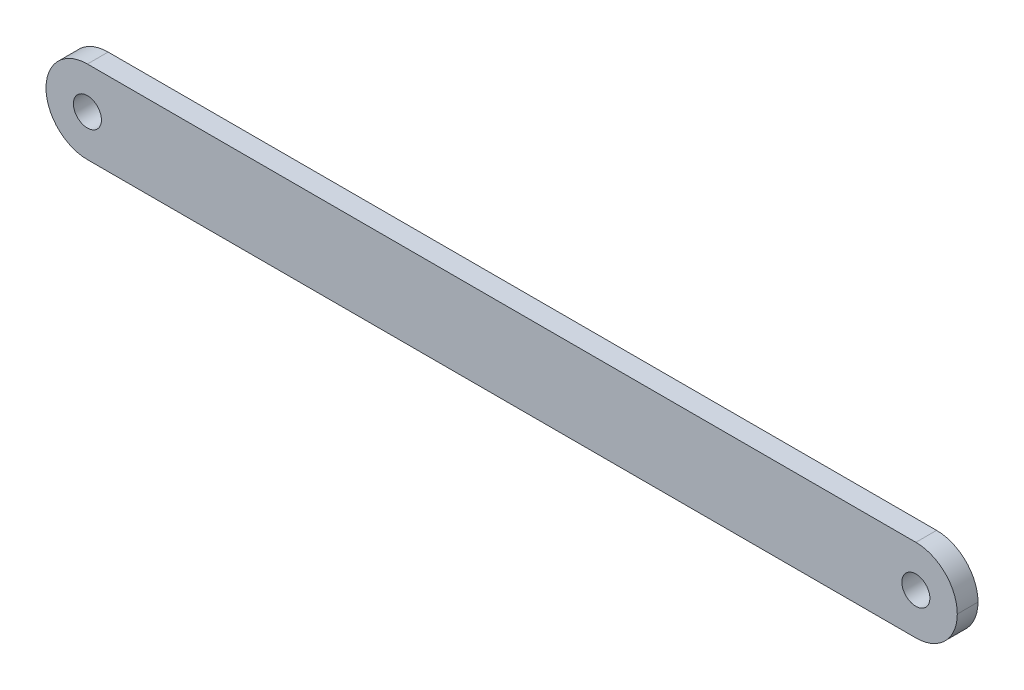
ISO-10303-21;
HEADER;
FILE_DESCRIPTION(('STEP AP214'),'2;1');
FILE_NAME('part.step','',(''),(''),'','','');
FILE_SCHEMA(('AUTOMOTIVE_DESIGN { 1 0 10303 214 1 1 1 1 }'));
ENDSEC;
DATA;
#1=APPLICATION_CONTEXT('core data for automotive mechanical design processes');
#2=APPLICATION_PROTOCOL_DEFINITION('international standard','automotive_design',2000,#1);
#3=PRODUCT_CONTEXT('',#1,'mechanical');
#4=PRODUCT('Part','Part','',(#3));
#5=PRODUCT_RELATED_PRODUCT_CATEGORY('part','',(#4));
#6=PRODUCT_DEFINITION_FORMATION('','',#4);
#7=PRODUCT_DEFINITION_CONTEXT('part definition',#1,'design');
#8=PRODUCT_DEFINITION('design','',#6,#7);
#9=PRODUCT_DEFINITION_SHAPE('','',#8);
#10=(LENGTH_UNIT() NAMED_UNIT(*) SI_UNIT(.MILLI.,.METRE.));
#11=(NAMED_UNIT(*) PLANE_ANGLE_UNIT() SI_UNIT($,.RADIAN.));
#12=(NAMED_UNIT(*) SI_UNIT($,.STERADIAN.) SOLID_ANGLE_UNIT());
#13=UNCERTAINTY_MEASURE_WITH_UNIT(LENGTH_MEASURE(1.E-05),#10,'distance_accuracy_value','');
#14=(GEOMETRIC_REPRESENTATION_CONTEXT(3) GLOBAL_UNCERTAINTY_ASSIGNED_CONTEXT((#13)) GLOBAL_UNIT_ASSIGNED_CONTEXT((#10,
#11,#12)) REPRESENTATION_CONTEXT('',''));
#15=CARTESIAN_POINT('',(0.,0.,0.));
#16=DIRECTION('',(0.,0.,1.));
#17=DIRECTION('',(1.,0.,0.));
#18=AXIS2_PLACEMENT_3D('',#15,#16,#17);
#19=CARTESIAN_POINT('',(55.8602219741314,4.,1.));
#20=DIRECTION('',(0.,0.,1.));
#21=DIRECTION('',(1.,0.,0.));
#22=AXIS2_PLACEMENT_3D('',#19,#20,#21);
#23=CYLINDRICAL_SURFACE('',#22,4.);
#24=CARTESIAN_POINT('',(55.8602219741314,4.,3.));
#25=DIRECTION('',(0.,0.,1.));
#26=DIRECTION('',(1.,0.,0.));
#27=AXIS2_PLACEMENT_3D('',#24,#25,#26);
#28=CIRCLE('',#27,4.);
#29=CARTESIAN_POINT('',(55.8602219741314,0.,3.));
#30=VERTEX_POINT('',#29);
#31=CARTESIAN_POINT('',(59.8602219741314,4.,3.));
#32=VERTEX_POINT('',#31);
#33=EDGE_CURVE('E123',#30,#32,#28,.T.);
#34=ORIENTED_EDGE('',*,*,#33,.F.);
#35=DIRECTION('',(0.,0.,1.));
#36=VECTOR('',#35,1.);
#37=CARTESIAN_POINT('',(55.8602219741314,0.,1.));
#38=LINE('',#37,#36);
#39=CARTESIAN_POINT('',(55.8602219741314,0.,1.));
#40=VERTEX_POINT('',#39);
#41=EDGE_CURVE('E11',#40,#30,#38,.T.);
#42=ORIENTED_EDGE('',*,*,#41,.F.);
#43=CARTESIAN_POINT('',(55.8602219741314,4.,1.));
#44=DIRECTION('',(0.,0.,1.));
#45=DIRECTION('',(1.,0.,0.));
#46=AXIS2_PLACEMENT_3D('',#43,#44,#45);
#47=CIRCLE('',#46,4.);
#48=CARTESIAN_POINT('',(59.8602219741314,4.,1.));
#49=VERTEX_POINT('',#48);
#50=EDGE_CURVE('E138',#40,#49,#47,.T.);
#51=ORIENTED_EDGE('',*,*,#50,.T.);
#52=DIRECTION('',(0.,0.,1.));
#53=VECTOR('',#52,1.);
#54=CARTESIAN_POINT('',(59.8602219741314,4.,1.));
#55=LINE('',#54,#53);
#56=EDGE_CURVE('E41',#49,#32,#55,.T.);
#57=ORIENTED_EDGE('',*,*,#56,.T.);
#58=EDGE_LOOP('',(#34,#42,#51,#57));
#59=FACE_BOUND('',#58,.T.);
#60=ADVANCED_FACE('F38',(#59),#23,.T.);
#61=CARTESIAN_POINT('',(-24.1383206601164,0.,1.));
#62=DIRECTION('',(0.,-1.,0.));
#63=DIRECTION('',(0.,0.,-1.));
#64=AXIS2_PLACEMENT_3D('',#61,#62,#63);
#65=PLANE('',#64);
#66=DIRECTION('',(1.,0.,0.));
#67=VECTOR('',#66,1.);
#68=CARTESIAN_POINT('',(-24.1383206601164,0.,3.));
#69=LINE('',#68,#67);
#70=CARTESIAN_POINT('',(-24.1383206601164,0.,3.));
#71=VERTEX_POINT('',#70);
#72=EDGE_CURVE('E136',#71,#30,#69,.T.);
#73=ORIENTED_EDGE('',*,*,#72,.F.);
#74=DIRECTION('',(0.,0.,1.));
#75=VECTOR('',#74,1.);
#76=CARTESIAN_POINT('',(-24.1383206601164,0.,1.));
#77=LINE('',#76,#75);
#78=CARTESIAN_POINT('',(-24.1383206601164,0.,1.));
#79=VERTEX_POINT('',#78);
#80=EDGE_CURVE('E47',#79,#71,#77,.T.);
#81=ORIENTED_EDGE('',*,*,#80,.F.);
#82=DIRECTION('',(1.,0.,0.));
#83=VECTOR('',#82,1.);
#84=CARTESIAN_POINT('',(-24.1383206601164,0.,1.));
#85=LINE('',#84,#83);
#86=EDGE_CURVE('E113',#79,#40,#85,.T.);
#87=ORIENTED_EDGE('',*,*,#86,.T.);
#88=ORIENTED_EDGE('',*,*,#41,.T.);
#89=EDGE_LOOP('',(#73,#81,#87,#88));
#90=FACE_BOUND('',#89,.T.);
#91=ADVANCED_FACE('F146',(#90),#65,.T.);
#92=CARTESIAN_POINT('',(-24.1383206601164,4.,1.));
#93=DIRECTION('',(0.,0.,1.));
#94=DIRECTION('',(1.,0.,0.));
#95=AXIS2_PLACEMENT_3D('',#92,#93,#94);
#96=CYLINDRICAL_SURFACE('',#95,4.);
#97=CARTESIAN_POINT('',(-24.1383206601164,4.,3.));
#98=DIRECTION('',(0.,0.,1.));
#99=DIRECTION('',(1.,0.,0.));
#100=AXIS2_PLACEMENT_3D('',#97,#98,#99);
#101=CIRCLE('',#100,4.);
#102=CARTESIAN_POINT('',(-28.1383205351164,3.999,3.));
#103=VERTEX_POINT('',#102);
#104=EDGE_CURVE('E100',#103,#71,#101,.T.);
#105=ORIENTED_EDGE('',*,*,#104,.F.);
#106=DIRECTION('',(0.,0.,1.));
#107=VECTOR('',#106,1.);
#108=CARTESIAN_POINT('',(-28.1383205351164,3.999,1.));
#109=LINE('',#108,#107);
#110=CARTESIAN_POINT('',(-28.1383205351164,3.999,1.));
#111=VERTEX_POINT('',#110);
#112=EDGE_CURVE('E95',#111,#103,#109,.T.);
#113=ORIENTED_EDGE('',*,*,#112,.F.);
#114=CARTESIAN_POINT('',(-24.1383206601164,4.,1.));
#115=DIRECTION('',(0.,0.,1.));
#116=DIRECTION('',(1.,0.,0.));
#117=AXIS2_PLACEMENT_3D('',#114,#115,#116);
#118=CIRCLE('',#117,4.);
#119=EDGE_CURVE('E98',#111,#79,#118,.T.);
#120=ORIENTED_EDGE('',*,*,#119,.T.);
#121=ORIENTED_EDGE('',*,*,#80,.T.);
#122=EDGE_LOOP('',(#105,#113,#120,#121));
#123=FACE_BOUND('',#122,.T.);
#124=ADVANCED_FACE('F97',(#123),#96,.T.);
#125=CARTESIAN_POINT('',(-24.1383205351164,3.999,1.));
#126=DIRECTION('',(0.,0.,1.));
#127=DIRECTION('',(1.,0.,0.));
#128=AXIS2_PLACEMENT_3D('',#125,#126,#127);
#129=CYLINDRICAL_SURFACE('',#128,4.);
#130=CARTESIAN_POINT('',(-24.1383205351164,3.999,3.));
#131=DIRECTION('',(0.,0.,1.));
#132=DIRECTION('',(1.,0.,0.));
#133=AXIS2_PLACEMENT_3D('',#130,#131,#132);
#134=CIRCLE('',#133,4.);
#135=CARTESIAN_POINT('',(-24.1383205351164,7.999,3.));
#136=VERTEX_POINT('',#135);
#137=EDGE_CURVE('E133',#136,#103,#134,.T.);
#138=ORIENTED_EDGE('',*,*,#137,.F.);
#139=DIRECTION('',(0.,0.,1.));
#140=VECTOR('',#139,1.);
#141=CARTESIAN_POINT('',(-24.1383205351164,7.999,1.));
#142=LINE('',#141,#140);
#143=CARTESIAN_POINT('',(-24.1383205351164,7.999,1.));
#144=VERTEX_POINT('',#143);
#145=EDGE_CURVE('E105',#144,#136,#142,.T.);
#146=ORIENTED_EDGE('',*,*,#145,.F.);
#147=CARTESIAN_POINT('',(-24.1383205351164,3.999,1.));
#148=DIRECTION('',(0.,0.,1.));
#149=DIRECTION('',(1.,0.,0.));
#150=AXIS2_PLACEMENT_3D('',#147,#148,#149);
#151=CIRCLE('',#150,4.);
#152=EDGE_CURVE('E111',#144,#111,#151,.T.);
#153=ORIENTED_EDGE('',*,*,#152,.T.);
#154=ORIENTED_EDGE('',*,*,#112,.T.);
#155=EDGE_LOOP('',(#138,#146,#153,#154));
#156=FACE_BOUND('',#155,.T.);
#157=ADVANCED_FACE('F115',(#156),#129,.T.);
#158=CARTESIAN_POINT('',(55.8602220991314,7.999,1.));
#159=DIRECTION('',(0.,1.,0.));
#160=DIRECTION('',(0.,0.,1.));
#161=AXIS2_PLACEMENT_3D('',#158,#159,#160);
#162=PLANE('',#161);
#163=DIRECTION('',(-1.,0.,0.));
#164=VECTOR('',#163,1.);
#165=CARTESIAN_POINT('',(55.8602220991314,7.999,3.));
#166=LINE('',#165,#164);
#167=CARTESIAN_POINT('',(55.8602220991314,7.999,3.));
#168=VERTEX_POINT('',#167);
#169=EDGE_CURVE('E130',#168,#136,#166,.T.);
#170=ORIENTED_EDGE('',*,*,#169,.F.);
#171=DIRECTION('',(0.,0.,1.));
#172=VECTOR('',#171,1.);
#173=CARTESIAN_POINT('',(55.8602220991314,7.999,1.));
#174=LINE('',#173,#172);
#175=CARTESIAN_POINT('',(55.8602220991314,7.999,1.));
#176=VERTEX_POINT('',#175);
#177=EDGE_CURVE('E141',#176,#168,#174,.T.);
#178=ORIENTED_EDGE('',*,*,#177,.F.);
#179=DIRECTION('',(-1.,0.,0.));
#180=VECTOR('',#179,1.);
#181=CARTESIAN_POINT('',(55.8602220991314,7.999,1.));
#182=LINE('',#181,#180);
#183=EDGE_CURVE('E116',#176,#144,#182,.T.);
#184=ORIENTED_EDGE('',*,*,#183,.T.);
#185=ORIENTED_EDGE('',*,*,#145,.T.);
#186=EDGE_LOOP('',(#170,#178,#184,#185));
#187=FACE_BOUND('',#186,.T.);
#188=ADVANCED_FACE('F159',(#187),#162,.T.);
#189=CARTESIAN_POINT('',(55.8602220991314,3.999,1.));
#190=DIRECTION('',(0.,0.,1.));
#191=DIRECTION('',(1.,0.,0.));
#192=AXIS2_PLACEMENT_3D('',#189,#190,#191);
#193=CYLINDRICAL_SURFACE('',#192,4.);
#194=CARTESIAN_POINT('',(55.8602220991314,3.999,3.));
#195=DIRECTION('',(0.,0.,1.));
#196=DIRECTION('',(1.,0.,0.));
#197=AXIS2_PLACEMENT_3D('',#194,#195,#196);
#198=CIRCLE('',#197,4.);
#199=EDGE_CURVE('E126',#32,#168,#198,.T.);
#200=ORIENTED_EDGE('',*,*,#199,.F.);
#201=ORIENTED_EDGE('',*,*,#56,.F.);
#202=CARTESIAN_POINT('',(55.8602220991314,3.999,1.));
#203=DIRECTION('',(0.,0.,1.));
#204=DIRECTION('',(1.,0.,0.));
#205=AXIS2_PLACEMENT_3D('',#202,#203,#204);
#206=CIRCLE('',#205,4.);
#207=EDGE_CURVE('E118',#49,#176,#206,.T.);
#208=ORIENTED_EDGE('',*,*,#207,.T.);
#209=ORIENTED_EDGE('',*,*,#177,.T.);
#210=EDGE_LOOP('',(#200,#201,#208,#209));
#211=FACE_BOUND('',#210,.T.);
#212=ADVANCED_FACE('F143',(#211),#193,.T.);
#213=CARTESIAN_POINT('',(55.8602219741314,4.,1.));
#214=DIRECTION('',(0.,0.,1.));
#215=DIRECTION('',(1.,0.,0.));
#216=AXIS2_PLACEMENT_3D('',#213,#214,#215);
#217=PLANE('',#216);
#218=CARTESIAN_POINT('',(-24.138809000818,3.99851153429841,1.));
#219=DIRECTION('',(0.,0.,1.));
#220=DIRECTION('',(-1.,0.,0.));
#221=AXIS2_PLACEMENT_3D('',#218,#219,#220);
#222=CIRCLE('',#221,1.35401050244143);
#223=CARTESIAN_POINT('',(-25.4928195032594,3.99851153429841,1.));
#224=VERTEX_POINT('',#223);
#225=EDGE_CURVE('E185',#224,#224,#222,.T.);
#226=ORIENTED_EDGE('',*,*,#225,.T.);
#227=EDGE_LOOP('',(#226));
#228=FACE_BOUND('',#227,.T.);
#229=CARTESIAN_POINT('',(55.8597335084298,3.99951153429841,1.));
#230=DIRECTION('',(0.,0.,1.));
#231=DIRECTION('',(-1.,0.,0.));
#232=AXIS2_PLACEMENT_3D('',#229,#230,#231);
#233=CIRCLE('',#232,1.35401050244143);
#234=CARTESIAN_POINT('',(54.5057230059884,3.99951153429841,1.));
#235=VERTEX_POINT('',#234);
#236=EDGE_CURVE('E127',#235,#235,#233,.T.);
#237=ORIENTED_EDGE('',*,*,#236,.T.);
#238=EDGE_LOOP('',(#237));
#239=FACE_BOUND('',#238,.T.);
#240=ORIENTED_EDGE('',*,*,#50,.F.);
#241=ORIENTED_EDGE('',*,*,#86,.F.);
#242=ORIENTED_EDGE('',*,*,#119,.F.);
#243=ORIENTED_EDGE('',*,*,#152,.F.);
#244=ORIENTED_EDGE('',*,*,#183,.F.);
#245=ORIENTED_EDGE('',*,*,#207,.F.);
#246=EDGE_LOOP('',(#240,#241,#242,#243,#244,#245));
#247=FACE_BOUND('',#246,.T.);
#248=ADVANCED_FACE('F109',(#228,#239,#247),#217,.F.);
#249=CARTESIAN_POINT('',(55.8602219741314,4.,3.));
#250=DIRECTION('',(0.,0.,1.));
#251=DIRECTION('',(1.,0.,0.));
#252=AXIS2_PLACEMENT_3D('',#249,#250,#251);
#253=PLANE('',#252);
#254=CARTESIAN_POINT('',(-24.138809000818,3.99851153429841,3.));
#255=DIRECTION('',(0.,0.,1.));
#256=DIRECTION('',(-1.,0.,0.));
#257=AXIS2_PLACEMENT_3D('',#254,#255,#256);
#258=CIRCLE('',#257,1.35401050244143);
#259=CARTESIAN_POINT('',(-25.4928195032594,3.99851153429841,3.));
#260=VERTEX_POINT('',#259);
#261=EDGE_CURVE('E188',#260,#260,#258,.T.);
#262=ORIENTED_EDGE('',*,*,#261,.F.);
#263=EDGE_LOOP('',(#262));
#264=FACE_BOUND('',#263,.T.);
#265=CARTESIAN_POINT('',(55.8597335084298,3.99951153429841,3.));
#266=DIRECTION('',(0.,0.,1.));
#267=DIRECTION('',(-1.,0.,0.));
#268=AXIS2_PLACEMENT_3D('',#265,#266,#267);
#269=CIRCLE('',#268,1.35401050244143);
#270=CARTESIAN_POINT('',(54.5057230059884,3.99951153429841,3.));
#271=VERTEX_POINT('',#270);
#272=EDGE_CURVE('E190',#271,#271,#269,.T.);
#273=ORIENTED_EDGE('',*,*,#272,.F.);
#274=EDGE_LOOP('',(#273));
#275=FACE_BOUND('',#274,.T.);
#276=ORIENTED_EDGE('',*,*,#33,.T.);
#277=ORIENTED_EDGE('',*,*,#199,.T.);
#278=ORIENTED_EDGE('',*,*,#169,.T.);
#279=ORIENTED_EDGE('',*,*,#137,.T.);
#280=ORIENTED_EDGE('',*,*,#104,.T.);
#281=ORIENTED_EDGE('',*,*,#72,.T.);
#282=EDGE_LOOP('',(#276,#277,#278,#279,#280,#281));
#283=FACE_BOUND('',#282,.T.);
#284=ADVANCED_FACE('F145',(#264,#275,#283),#253,.T.);
#285=CARTESIAN_POINT('',(55.8597335084298,3.99951153429841,1.));
#286=DIRECTION('',(0.,0.,1.));
#287=DIRECTION('',(1.,0.,0.));
#288=AXIS2_PLACEMENT_3D('',#285,#286,#287);
#289=CYLINDRICAL_SURFACE('',#288,1.35401050244143);
#290=ORIENTED_EDGE('',*,*,#236,.F.);
#291=EDGE_LOOP('',(#290));
#292=FACE_BOUND('',#291,.T.);
#293=ORIENTED_EDGE('',*,*,#272,.T.);
#294=EDGE_LOOP('',(#293));
#295=FACE_BOUND('',#294,.T.);
#296=ADVANCED_FACE('F170',(#292,#295),#289,.F.);
#297=CARTESIAN_POINT('',(-24.138809000818,3.99851153429841,1.));
#298=DIRECTION('',(0.,0.,1.));
#299=DIRECTION('',(1.,0.,0.));
#300=AXIS2_PLACEMENT_3D('',#297,#298,#299);
#301=CYLINDRICAL_SURFACE('',#300,1.35401050244143);
#302=ORIENTED_EDGE('',*,*,#225,.F.);
#303=EDGE_LOOP('',(#302));
#304=FACE_BOUND('',#303,.T.);
#305=ORIENTED_EDGE('',*,*,#261,.T.);
#306=EDGE_LOOP('',(#305));
#307=FACE_BOUND('',#306,.T.);
#308=ADVANCED_FACE('F177',(#304,#307),#301,.F.);
#309=CLOSED_SHELL('',(#60,#91,#124,#157,#188,#212,#248,#284,#296,#308));
#310=MANIFOLD_SOLID_BREP('B2',#309);
#311=ADVANCED_BREP_SHAPE_REPRESENTATION('',(#18,#310),#14);
#312=SHAPE_DEFINITION_REPRESENTATION(#9,#311);
ENDSEC;
END-ISO-10303-21;
